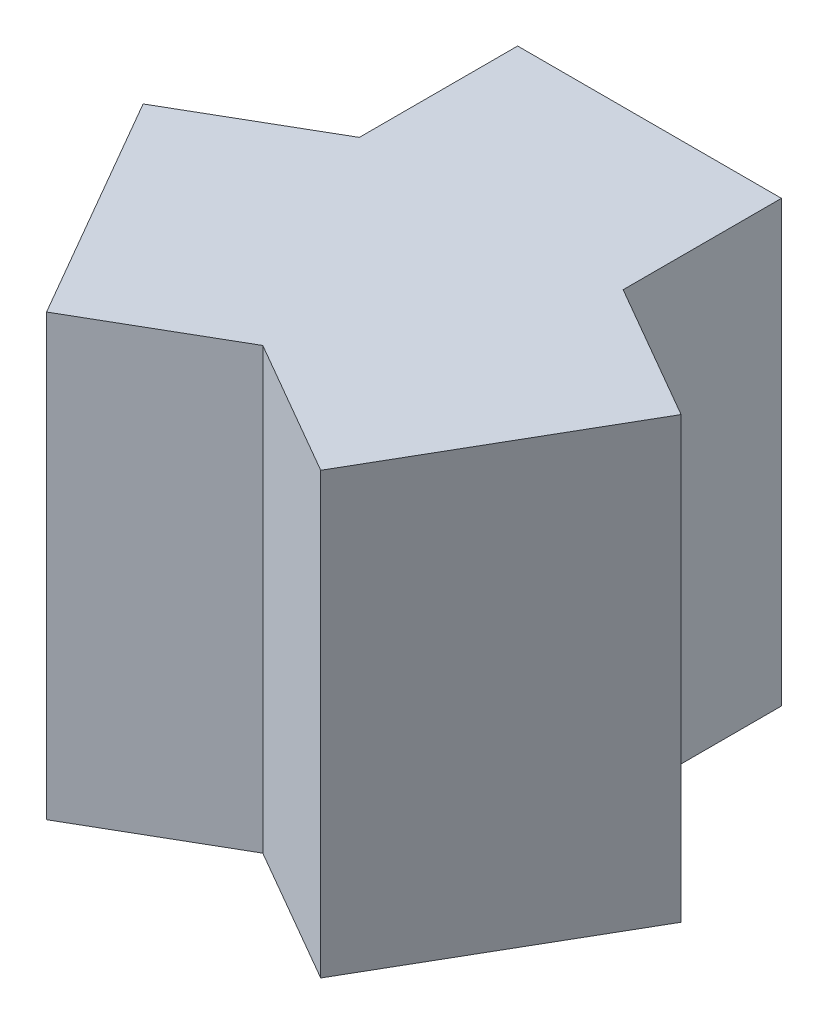
ISO-10303-21;
HEADER;
FILE_DESCRIPTION(('STEP AP214'),'2;1');
FILE_NAME('part.step','',(''),(''),'','','');
FILE_SCHEMA(('AUTOMOTIVE_DESIGN { 1 0 10303 214 1 1 1 1 }'));
ENDSEC;
DATA;
#1=APPLICATION_CONTEXT('core data for automotive mechanical design processes');
#2=APPLICATION_PROTOCOL_DEFINITION('international standard','automotive_design',2000,#1);
#3=PRODUCT_CONTEXT('',#1,'mechanical');
#4=PRODUCT('Part','Part','',(#3));
#5=PRODUCT_RELATED_PRODUCT_CATEGORY('part','',(#4));
#6=PRODUCT_DEFINITION_FORMATION('','',#4);
#7=PRODUCT_DEFINITION_CONTEXT('part definition',#1,'design');
#8=PRODUCT_DEFINITION('design','',#6,#7);
#9=PRODUCT_DEFINITION_SHAPE('','',#8);
#10=(LENGTH_UNIT() NAMED_UNIT(*) SI_UNIT(.MILLI.,.METRE.));
#11=(NAMED_UNIT(*) PLANE_ANGLE_UNIT() SI_UNIT($,.RADIAN.));
#12=(NAMED_UNIT(*) SI_UNIT($,.STERADIAN.) SOLID_ANGLE_UNIT());
#13=UNCERTAINTY_MEASURE_WITH_UNIT(LENGTH_MEASURE(1.E-05),#10,'distance_accuracy_value','');
#14=(GEOMETRIC_REPRESENTATION_CONTEXT(3) GLOBAL_UNCERTAINTY_ASSIGNED_CONTEXT((#13)) GLOBAL_UNIT_ASSIGNED_CONTEXT((#10,
#11,#12)) REPRESENTATION_CONTEXT('',''));
#15=CARTESIAN_POINT('',(0.,0.,0.));
#16=DIRECTION('',(0.,0.,1.));
#17=DIRECTION('',(1.,0.,0.));
#18=AXIS2_PLACEMENT_3D('',#15,#16,#17);
#19=CARTESIAN_POINT('',(7.50000000000006,12.5,-5.));
#20=DIRECTION('',(-1.,0.,0.));
#21=DIRECTION('',(0.,0.,1.));
#22=AXIS2_PLACEMENT_3D('',#19,#20,#21);
#23=PLANE('',#22);
#24=DIRECTION('',(0.,0.,-1.));
#25=VECTOR('',#24,1.);
#26=CARTESIAN_POINT('',(7.50000000000006,-12.5,-5.));
#27=LINE('',#26,#25);
#28=CARTESIAN_POINT('',(7.50000000000006,-12.5,-5.));
#29=VERTEX_POINT('',#28);
#30=CARTESIAN_POINT('',(7.50000000000006,-12.5,-14.));
#31=VERTEX_POINT('',#30);
#32=EDGE_CURVE('E146',#29,#31,#27,.T.);
#33=ORIENTED_EDGE('',*,*,#32,.T.);
#34=DIRECTION('',(0.,-1.,0.));
#35=VECTOR('',#34,1.);
#36=CARTESIAN_POINT('',(7.50000000000006,12.5,-14.));
#37=LINE('',#36,#35);
#38=CARTESIAN_POINT('',(7.50000000000006,12.5,-14.));
#39=VERTEX_POINT('',#38);
#40=EDGE_CURVE('E11',#39,#31,#37,.T.);
#41=ORIENTED_EDGE('',*,*,#40,.F.);
#42=DIRECTION('',(0.,0.,-1.));
#43=VECTOR('',#42,1.);
#44=CARTESIAN_POINT('',(7.50000000000006,12.5,-5.));
#45=LINE('',#44,#43);
#46=CARTESIAN_POINT('',(7.50000000000006,12.5,-5.));
#47=VERTEX_POINT('',#46);
#48=EDGE_CURVE('E171',#47,#39,#45,.T.);
#49=ORIENTED_EDGE('',*,*,#48,.F.);
#50=DIRECTION('',(0.,-1.,0.));
#51=VECTOR('',#50,1.);
#52=CARTESIAN_POINT('',(7.50000000000006,12.5,-5.));
#53=LINE('',#52,#51);
#54=EDGE_CURVE('E142',#47,#29,#53,.T.);
#55=ORIENTED_EDGE('',*,*,#54,.T.);
#56=EDGE_LOOP('',(#33,#41,#49,#55));
#57=FACE_BOUND('',#56,.T.);
#58=ADVANCED_FACE('F39',(#57),#23,.F.);
#59=CARTESIAN_POINT('',(-7.50000000000006,12.5,-14.));
#60=DIRECTION('',(0.,0.,1.));
#61=DIRECTION('',(1.,0.,0.));
#62=AXIS2_PLACEMENT_3D('',#59,#60,#61);
#63=PLANE('',#62);
#64=DIRECTION('',(-1.,0.,0.));
#65=VECTOR('',#64,1.);
#66=CARTESIAN_POINT('',(-7.50000000000006,-12.5,-14.));
#67=LINE('',#66,#65);
#68=CARTESIAN_POINT('',(-7.50000000000006,-12.5,-14.));
#69=VERTEX_POINT('',#68);
#70=EDGE_CURVE('E150',#31,#69,#67,.T.);
#71=ORIENTED_EDGE('',*,*,#70,.T.);
#72=DIRECTION('',(0.,-1.,0.));
#73=VECTOR('',#72,1.);
#74=CARTESIAN_POINT('',(-7.50000000000006,12.5,-14.));
#75=LINE('',#74,#73);
#76=CARTESIAN_POINT('',(-7.50000000000006,12.5,-14.));
#77=VERTEX_POINT('',#76);
#78=EDGE_CURVE('E48',#77,#69,#75,.T.);
#79=ORIENTED_EDGE('',*,*,#78,.F.);
#80=DIRECTION('',(-1.,0.,0.));
#81=VECTOR('',#80,1.);
#82=CARTESIAN_POINT('',(-7.50000000000006,12.5,-14.));
#83=LINE('',#82,#81);
#84=EDGE_CURVE('E102',#39,#77,#83,.T.);
#85=ORIENTED_EDGE('',*,*,#84,.F.);
#86=ORIENTED_EDGE('',*,*,#40,.T.);
#87=EDGE_LOOP('',(#71,#79,#85,#86));
#88=FACE_BOUND('',#87,.T.);
#89=ADVANCED_FACE('F227',(#88),#63,.F.);
#90=CARTESIAN_POINT('',(-7.50000000000006,12.5,-5.));
#91=DIRECTION('',(1.,0.,0.));
#92=DIRECTION('',(0.,0.,-1.));
#93=AXIS2_PLACEMENT_3D('',#90,#91,#92);
#94=PLANE('',#93);
#95=DIRECTION('',(0.,0.,1.));
#96=VECTOR('',#95,1.);
#97=CARTESIAN_POINT('',(-7.50000000000006,-12.5,-5.));
#98=LINE('',#97,#96);
#99=CARTESIAN_POINT('',(-7.50000000000006,-12.5,-5.));
#100=VERTEX_POINT('',#99);
#101=EDGE_CURVE('E153',#69,#100,#98,.T.);
#102=ORIENTED_EDGE('',*,*,#101,.T.);
#103=DIRECTION('',(0.,-1.,0.));
#104=VECTOR('',#103,1.);
#105=CARTESIAN_POINT('',(-7.50000000000006,12.5,-5.));
#106=LINE('',#105,#104);
#107=CARTESIAN_POINT('',(-7.50000000000006,12.5,-5.));
#108=VERTEX_POINT('',#107);
#109=EDGE_CURVE('E186',#108,#100,#106,.T.);
#110=ORIENTED_EDGE('',*,*,#109,.F.);
#111=DIRECTION('',(0.,0.,1.));
#112=VECTOR('',#111,1.);
#113=CARTESIAN_POINT('',(-7.50000000000006,12.5,-5.));
#114=LINE('',#113,#112);
#115=EDGE_CURVE('E196',#77,#108,#114,.T.);
#116=ORIENTED_EDGE('',*,*,#115,.F.);
#117=ORIENTED_EDGE('',*,*,#78,.T.);
#118=EDGE_LOOP('',(#102,#110,#116,#117));
#119=FACE_BOUND('',#118,.T.);
#120=ADVANCED_FACE('F194',(#119),#94,.F.);
#121=CARTESIAN_POINT('',(-15.29422863406,12.5,-0.499999999999995));
#122=DIRECTION('',(0.5,0.,0.866025403784438));
#123=DIRECTION('',(0.866025403784438,0.,-0.5));
#124=AXIS2_PLACEMENT_3D('',#121,#122,#123);
#125=PLANE('',#124);
#126=DIRECTION('',(-0.866025403784438,0.,0.5));
#127=VECTOR('',#126,1.);
#128=CARTESIAN_POINT('',(-15.29422863406,-12.5,-0.499999999999995));
#129=LINE('',#128,#127);
#130=CARTESIAN_POINT('',(-15.29422863406,-12.5,-0.499999999999995));
#131=VERTEX_POINT('',#130);
#132=EDGE_CURVE('E156',#100,#131,#129,.T.);
#133=ORIENTED_EDGE('',*,*,#132,.T.);
#134=DIRECTION('',(0.,-1.,0.));
#135=VECTOR('',#134,1.);
#136=CARTESIAN_POINT('',(-15.29422863406,12.5,-0.499999999999995));
#137=LINE('',#136,#135);
#138=CARTESIAN_POINT('',(-15.29422863406,12.5,-0.499999999999995));
#139=VERTEX_POINT('',#138);
#140=EDGE_CURVE('E182',#139,#131,#137,.T.);
#141=ORIENTED_EDGE('',*,*,#140,.F.);
#142=DIRECTION('',(-0.866025403784438,0.,0.5));
#143=VECTOR('',#142,1.);
#144=CARTESIAN_POINT('',(-15.29422863406,12.5,-0.499999999999995));
#145=LINE('',#144,#143);
#146=EDGE_CURVE('E213',#108,#139,#145,.T.);
#147=ORIENTED_EDGE('',*,*,#146,.F.);
#148=ORIENTED_EDGE('',*,*,#109,.T.);
#149=EDGE_LOOP('',(#133,#141,#147,#148));
#150=FACE_BOUND('',#149,.T.);
#151=ADVANCED_FACE('F205',(#150),#125,.F.);
#152=CARTESIAN_POINT('',(-15.29422863406,12.5,-0.499999999999995));
#153=DIRECTION('',(0.866025403784438,0.,-0.5));
#154=DIRECTION('',(-0.5,0.,-0.866025403784439));
#155=AXIS2_PLACEMENT_3D('',#152,#153,#154);
#156=PLANE('',#155);
#157=DIRECTION('',(0.5,0.,0.866025403784438));
#158=VECTOR('',#157,1.);
#159=CARTESIAN_POINT('',(-15.29422863406,-12.5,-0.499999999999995));
#160=LINE('',#159,#158);
#161=CARTESIAN_POINT('',(-7.79422863405994,-12.5,12.4903810567667));
#162=VERTEX_POINT('',#161);
#163=EDGE_CURVE('E159',#131,#162,#160,.T.);
#164=ORIENTED_EDGE('',*,*,#163,.T.);
#165=DIRECTION('',(0.,-1.,0.));
#166=VECTOR('',#165,1.);
#167=CARTESIAN_POINT('',(-7.79422863405994,12.5,12.4903810567667));
#168=LINE('',#167,#166);
#169=CARTESIAN_POINT('',(-7.79422863405994,12.5,12.4903810567667));
#170=VERTEX_POINT('',#169);
#171=EDGE_CURVE('E178',#170,#162,#168,.T.);
#172=ORIENTED_EDGE('',*,*,#171,.F.);
#173=DIRECTION('',(0.5,0.,0.866025403784438));
#174=VECTOR('',#173,1.);
#175=CARTESIAN_POINT('',(-15.29422863406,12.5,-0.499999999999995));
#176=LINE('',#175,#174);
#177=EDGE_CURVE('E211',#139,#170,#176,.T.);
#178=ORIENTED_EDGE('',*,*,#177,.F.);
#179=ORIENTED_EDGE('',*,*,#140,.T.);
#180=EDGE_LOOP('',(#164,#172,#178,#179));
#181=FACE_BOUND('',#180,.T.);
#182=ADVANCED_FACE('F209',(#181),#156,.F.);
#183=CARTESIAN_POINT('',(0.,12.5,7.99038105676669));
#184=DIRECTION('',(-0.5,0.,-0.866025403784438));
#185=DIRECTION('',(-0.866025403784439,0.,0.5));
#186=AXIS2_PLACEMENT_3D('',#183,#184,#185);
#187=PLANE('',#186);
#188=DIRECTION('',(0.866025403784439,0.,-0.5));
#189=VECTOR('',#188,1.);
#190=CARTESIAN_POINT('',(0.,-12.5,7.99038105676669));
#191=LINE('',#190,#189);
#192=CARTESIAN_POINT('',(0.,-12.5,7.99038105676669));
#193=VERTEX_POINT('',#192);
#194=EDGE_CURVE('E162',#162,#193,#191,.T.);
#195=ORIENTED_EDGE('',*,*,#194,.T.);
#196=DIRECTION('',(0.,-1.,0.));
#197=VECTOR('',#196,1.);
#198=CARTESIAN_POINT('',(0.,12.5,7.99038105676669));
#199=LINE('',#198,#197);
#200=CARTESIAN_POINT('',(0.,12.5,7.99038105676669));
#201=VERTEX_POINT('',#200);
#202=EDGE_CURVE('E135',#201,#193,#199,.T.);
#203=ORIENTED_EDGE('',*,*,#202,.F.);
#204=DIRECTION('',(0.866025403784439,0.,-0.5));
#205=VECTOR('',#204,1.);
#206=CARTESIAN_POINT('',(0.,12.5,7.99038105676669));
#207=LINE('',#206,#205);
#208=EDGE_CURVE('E124',#170,#201,#207,.T.);
#209=ORIENTED_EDGE('',*,*,#208,.F.);
#210=ORIENTED_EDGE('',*,*,#171,.T.);
#211=EDGE_LOOP('',(#195,#203,#209,#210));
#212=FACE_BOUND('',#211,.T.);
#213=ADVANCED_FACE('F239',(#212),#187,.F.);
#214=CARTESIAN_POINT('',(0.,12.5,7.99038105676669));
#215=DIRECTION('',(0.499999999999999,0.,-0.866025403784439));
#216=DIRECTION('',(-0.866025403784439,0.,-0.499999999999999));
#217=AXIS2_PLACEMENT_3D('',#214,#215,#216);
#218=PLANE('',#217);
#219=DIRECTION('',(0.866025403784439,0.,0.499999999999999));
#220=VECTOR('',#219,1.);
#221=CARTESIAN_POINT('',(0.,-12.5,7.99038105676669));
#222=LINE('',#221,#220);
#223=CARTESIAN_POINT('',(7.79422863405995,-12.5,12.4903810567667));
#224=VERTEX_POINT('',#223);
#225=EDGE_CURVE('E133',#193,#224,#222,.T.);
#226=ORIENTED_EDGE('',*,*,#225,.T.);
#227=DIRECTION('',(0.,-1.,0.));
#228=VECTOR('',#227,1.);
#229=CARTESIAN_POINT('',(7.79422863405995,12.5,12.4903810567667));
#230=LINE('',#229,#228);
#231=CARTESIAN_POINT('',(7.79422863405995,12.5,12.4903810567667));
#232=VERTEX_POINT('',#231);
#233=EDGE_CURVE('E130',#232,#224,#230,.T.);
#234=ORIENTED_EDGE('',*,*,#233,.F.);
#235=DIRECTION('',(0.866025403784439,0.,0.499999999999999));
#236=VECTOR('',#235,1.);
#237=CARTESIAN_POINT('',(0.,12.5,7.99038105676669));
#238=LINE('',#237,#236);
#239=EDGE_CURVE('E118',#201,#232,#238,.T.);
#240=ORIENTED_EDGE('',*,*,#239,.F.);
#241=ORIENTED_EDGE('',*,*,#202,.T.);
#242=EDGE_LOOP('',(#226,#234,#240,#241));
#243=FACE_BOUND('',#242,.T.);
#244=ADVANCED_FACE('F131',(#243),#218,.F.);
#245=CARTESIAN_POINT('',(15.29422863406,12.5,-0.499999999999999));
#246=DIRECTION('',(-0.866025403784439,0.,-0.5));
#247=DIRECTION('',(-0.5,0.,0.866025403784439));
#248=AXIS2_PLACEMENT_3D('',#245,#246,#247);
#249=PLANE('',#248);
#250=DIRECTION('',(0.5,0.,-0.866025403784439));
#251=VECTOR('',#250,1.);
#252=CARTESIAN_POINT('',(15.29422863406,-12.5,-0.499999999999999));
#253=LINE('',#252,#251);
#254=CARTESIAN_POINT('',(15.29422863406,-12.5,-0.499999999999999));
#255=VERTEX_POINT('',#254);
#256=EDGE_CURVE('E88',#224,#255,#253,.T.);
#257=ORIENTED_EDGE('',*,*,#256,.T.);
#258=DIRECTION('',(0.,-1.,0.));
#259=VECTOR('',#258,1.);
#260=CARTESIAN_POINT('',(15.29422863406,12.5,-0.499999999999999));
#261=LINE('',#260,#259);
#262=CARTESIAN_POINT('',(15.29422863406,12.5,-0.499999999999999));
#263=VERTEX_POINT('',#262);
#264=EDGE_CURVE('E136',#263,#255,#261,.T.);
#265=ORIENTED_EDGE('',*,*,#264,.F.);
#266=DIRECTION('',(0.5,0.,-0.866025403784439));
#267=VECTOR('',#266,1.);
#268=CARTESIAN_POINT('',(15.29422863406,12.5,-0.499999999999999));
#269=LINE('',#268,#267);
#270=EDGE_CURVE('E122',#232,#263,#269,.T.);
#271=ORIENTED_EDGE('',*,*,#270,.F.);
#272=ORIENTED_EDGE('',*,*,#233,.T.);
#273=EDGE_LOOP('',(#257,#265,#271,#272));
#274=FACE_BOUND('',#273,.T.);
#275=ADVANCED_FACE('F138',(#274),#249,.F.);
#276=CARTESIAN_POINT('',(15.29422863406,12.5,-0.499999999999999));
#277=DIRECTION('',(-0.5,0.,0.866025403784439));
#278=DIRECTION('',(0.866025403784439,0.,0.5));
#279=AXIS2_PLACEMENT_3D('',#276,#277,#278);
#280=PLANE('',#279);
#281=DIRECTION('',(-0.866025403784439,0.,-0.5));
#282=VECTOR('',#281,1.);
#283=CARTESIAN_POINT('',(15.29422863406,-12.5,-0.499999999999999));
#284=LINE('',#283,#282);
#285=EDGE_CURVE('E94',#255,#29,#284,.T.);
#286=ORIENTED_EDGE('',*,*,#285,.T.);
#287=ORIENTED_EDGE('',*,*,#54,.F.);
#288=DIRECTION('',(-0.866025403784439,0.,-0.5));
#289=VECTOR('',#288,1.);
#290=CARTESIAN_POINT('',(15.29422863406,12.5,-0.499999999999999));
#291=LINE('',#290,#289);
#292=EDGE_CURVE('E56',#263,#47,#291,.T.);
#293=ORIENTED_EDGE('',*,*,#292,.F.);
#294=ORIENTED_EDGE('',*,*,#264,.T.);
#295=EDGE_LOOP('',(#286,#287,#293,#294));
#296=FACE_BOUND('',#295,.T.);
#297=ADVANCED_FACE('F247',(#296),#280,.F.);
#298=CARTESIAN_POINT('',(0.,12.5,0.));
#299=DIRECTION('',(0.,-1.,0.));
#300=DIRECTION('',(0.,0.,-1.));
#301=AXIS2_PLACEMENT_3D('',#298,#299,#300);
#302=PLANE('',#301);
#303=ORIENTED_EDGE('',*,*,#48,.T.);
#304=ORIENTED_EDGE('',*,*,#84,.T.);
#305=ORIENTED_EDGE('',*,*,#115,.T.);
#306=ORIENTED_EDGE('',*,*,#146,.T.);
#307=ORIENTED_EDGE('',*,*,#177,.T.);
#308=ORIENTED_EDGE('',*,*,#208,.T.);
#309=ORIENTED_EDGE('',*,*,#239,.T.);
#310=ORIENTED_EDGE('',*,*,#270,.T.);
#311=ORIENTED_EDGE('',*,*,#292,.T.);
#312=EDGE_LOOP('',(#303,#304,#305,#306,#307,#308,#309,#310,#311));
#313=FACE_BOUND('',#312,.T.);
#314=ADVANCED_FACE('F120',(#313),#302,.F.);
#315=CARTESIAN_POINT('',(0.,-12.5,0.));
#316=DIRECTION('',(0.,-1.,0.));
#317=DIRECTION('',(0.,0.,-1.));
#318=AXIS2_PLACEMENT_3D('',#315,#316,#317);
#319=PLANE('',#318);
#320=ORIENTED_EDGE('',*,*,#32,.F.);
#321=ORIENTED_EDGE('',*,*,#285,.F.);
#322=ORIENTED_EDGE('',*,*,#256,.F.);
#323=ORIENTED_EDGE('',*,*,#225,.F.);
#324=ORIENTED_EDGE('',*,*,#194,.F.);
#325=ORIENTED_EDGE('',*,*,#163,.F.);
#326=ORIENTED_EDGE('',*,*,#132,.F.);
#327=ORIENTED_EDGE('',*,*,#101,.F.);
#328=ORIENTED_EDGE('',*,*,#70,.F.);
#329=EDGE_LOOP('',(#320,#321,#322,#323,#324,#325,#326,#327,#328));
#330=FACE_BOUND('',#329,.T.);
#331=ADVANCED_FACE('F200',(#330),#319,.T.);
#332=CLOSED_SHELL('',(#58,#89,#120,#151,#182,#213,#244,#275,#297,#314,#331));
#333=MANIFOLD_SOLID_BREP('B2',#332);
#334=ADVANCED_BREP_SHAPE_REPRESENTATION('',(#18,#333),#14);
#335=SHAPE_DEFINITION_REPRESENTATION(#9,#334);
ENDSEC;
END-ISO-10303-21;
